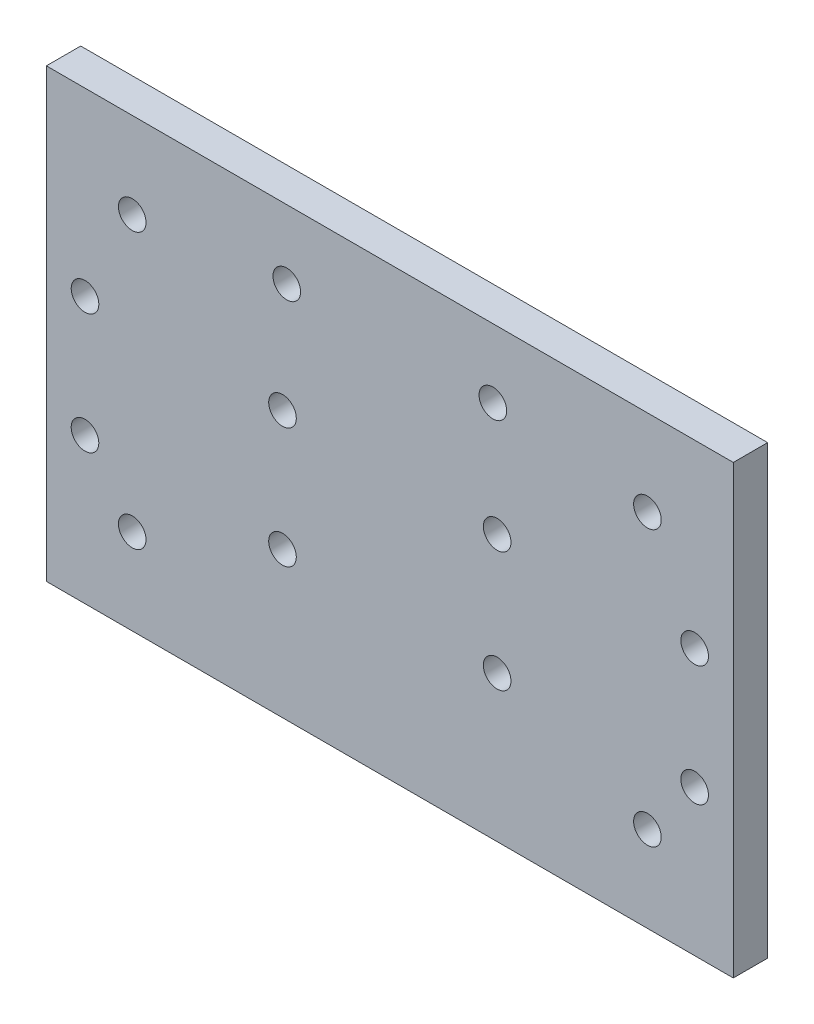
ISO-10303-21;
HEADER;
FILE_DESCRIPTION(('STEP AP214'),'2;1');
FILE_NAME('part.step','',(''),(''),'','','');
FILE_SCHEMA(('AUTOMOTIVE_DESIGN { 1 0 10303 214 1 1 1 1 }'));
ENDSEC;
DATA;
#1=APPLICATION_CONTEXT('core data for automotive mechanical design processes');
#2=APPLICATION_PROTOCOL_DEFINITION('international standard','automotive_design',2000,#1);
#3=PRODUCT_CONTEXT('',#1,'mechanical');
#4=PRODUCT('Part','Part','',(#3));
#5=PRODUCT_RELATED_PRODUCT_CATEGORY('part','',(#4));
#6=PRODUCT_DEFINITION_FORMATION('','',#4);
#7=PRODUCT_DEFINITION_CONTEXT('part definition',#1,'design');
#8=PRODUCT_DEFINITION('design','',#6,#7);
#9=PRODUCT_DEFINITION_SHAPE('','',#8);
#10=(LENGTH_UNIT() NAMED_UNIT(*) SI_UNIT(.MILLI.,.METRE.));
#11=(NAMED_UNIT(*) PLANE_ANGLE_UNIT() SI_UNIT($,.RADIAN.));
#12=(NAMED_UNIT(*) SI_UNIT($,.STERADIAN.) SOLID_ANGLE_UNIT());
#13=UNCERTAINTY_MEASURE_WITH_UNIT(LENGTH_MEASURE(1.E-05),#10,'distance_accuracy_value','');
#14=(GEOMETRIC_REPRESENTATION_CONTEXT(3) GLOBAL_UNCERTAINTY_ASSIGNED_CONTEXT((#13)) GLOBAL_UNIT_ASSIGNED_CONTEXT((#10,
#11,#12)) REPRESENTATION_CONTEXT('',''));
#15=CARTESIAN_POINT('',(0.,0.,0.));
#16=DIRECTION('',(0.,0.,1.));
#17=DIRECTION('',(1.,0.,0.));
#18=AXIS2_PLACEMENT_3D('',#15,#16,#17);
#19=CARTESIAN_POINT('',(0.,0.,0.));
#20=DIRECTION('',(0.,0.,1.));
#21=DIRECTION('',(1.,0.,0.));
#22=AXIS2_PLACEMENT_3D('',#19,#20,#21);
#23=PLANE('',#22);
#24=CARTESIAN_POINT('',(-47.625,-25.4,0.));
#25=DIRECTION('',(0.,0.,-1.));
#26=DIRECTION('',(-1.,0.,0.));
#27=AXIS2_PLACEMENT_3D('',#24,#25,#26);
#28=CIRCLE('',#27,2.55269999999999);
#29=CARTESIAN_POINT('',(-50.1777,-25.4,0.));
#30=VERTEX_POINT('',#29);
#31=EDGE_CURVE('E190',#30,#30,#28,.T.);
#32=ORIENTED_EDGE('',*,*,#31,.F.);
#33=EDGE_LOOP('',(#32));
#34=FACE_BOUND('',#33,.T.);
#35=CARTESIAN_POINT('',(-47.625,25.4,0.));
#36=DIRECTION('',(0.,0.,-1.));
#37=DIRECTION('',(-1.,0.,0.));
#38=AXIS2_PLACEMENT_3D('',#35,#36,#37);
#39=CIRCLE('',#38,2.55269999999998);
#40=CARTESIAN_POINT('',(-50.1777,25.4,0.));
#41=VERTEX_POINT('',#40);
#42=EDGE_CURVE('E178',#41,#41,#39,.T.);
#43=ORIENTED_EDGE('',*,*,#42,.F.);
#44=EDGE_LOOP('',(#43));
#45=FACE_BOUND('',#44,.T.);
#46=CARTESIAN_POINT('',(-19.844,7.93749999999997,0.));
#47=DIRECTION('',(0.,0.,-1.));
#48=DIRECTION('',(-1.,0.,0.));
#49=AXIS2_PLACEMENT_3D('',#46,#47,#48);
#50=CIRCLE('',#49,2.55269999999999);
#51=CARTESIAN_POINT('',(-22.3967,7.93749999999997,0.));
#52=VERTEX_POINT('',#51);
#53=EDGE_CURVE('E148',#52,#52,#50,.T.);
#54=ORIENTED_EDGE('',*,*,#53,.F.);
#55=EDGE_LOOP('',(#54));
#56=FACE_BOUND('',#55,.T.);
#57=CARTESIAN_POINT('',(-56.3565,-14.2875,0.));
#58=DIRECTION('',(0.,0.,-1.));
#59=DIRECTION('',(-1.,0.,0.));
#60=AXIS2_PLACEMENT_3D('',#57,#58,#59);
#61=CIRCLE('',#60,2.55269999999998);
#62=CARTESIAN_POINT('',(-58.9092,-14.2875,0.));
#63=VERTEX_POINT('',#62);
#64=EDGE_CURVE('E142',#63,#63,#61,.T.);
#65=ORIENTED_EDGE('',*,*,#64,.F.);
#66=EDGE_LOOP('',(#65));
#67=FACE_BOUND('',#66,.T.);
#68=CARTESIAN_POINT('',(-19.844,-14.2875,0.));
#69=DIRECTION('',(0.,0.,-1.));
#70=DIRECTION('',(-1.,0.,0.));
#71=AXIS2_PLACEMENT_3D('',#68,#69,#70);
#72=CIRCLE('',#71,2.55269999999999);
#73=CARTESIAN_POINT('',(-22.3967,-14.2875,0.));
#74=VERTEX_POINT('',#73);
#75=EDGE_CURVE('E136',#74,#74,#72,.T.);
#76=ORIENTED_EDGE('',*,*,#75,.F.);
#77=EDGE_LOOP('',(#76));
#78=FACE_BOUND('',#77,.T.);
#79=CARTESIAN_POINT('',(-56.3565,7.9375,0.));
#80=DIRECTION('',(0.,0.,-1.));
#81=DIRECTION('',(-1.,0.,0.));
#82=AXIS2_PLACEMENT_3D('',#79,#80,#81);
#83=CIRCLE('',#82,2.55269999999998);
#84=CARTESIAN_POINT('',(-58.9092,7.9375,0.));
#85=VERTEX_POINT('',#84);
#86=EDGE_CURVE('E130',#85,#85,#83,.T.);
#87=ORIENTED_EDGE('',*,*,#86,.F.);
#88=EDGE_LOOP('',(#87));
#89=FACE_BOUND('',#88,.T.);
#90=CARTESIAN_POINT('',(19.05,28.575,0.));
#91=DIRECTION('',(0.,0.,-1.));
#92=DIRECTION('',(-1.,0.,0.));
#93=AXIS2_PLACEMENT_3D('',#90,#91,#92);
#94=CIRCLE('',#93,2.55269999999999);
#95=CARTESIAN_POINT('',(16.4973,28.575,0.));
#96=VERTEX_POINT('',#95);
#97=EDGE_CURVE('E124',#96,#96,#94,.T.);
#98=ORIENTED_EDGE('',*,*,#97,.F.);
#99=EDGE_LOOP('',(#98));
#100=FACE_BOUND('',#99,.T.);
#101=CARTESIAN_POINT('',(-19.05,28.575,0.));
#102=DIRECTION('',(0.,0.,-1.));
#103=DIRECTION('',(-1.,0.,0.));
#104=AXIS2_PLACEMENT_3D('',#101,#102,#103);
#105=CIRCLE('',#104,2.55269999999999);
#106=CARTESIAN_POINT('',(-21.6027,28.575,0.));
#107=VERTEX_POINT('',#106);
#108=EDGE_CURVE('E118',#107,#107,#105,.T.);
#109=ORIENTED_EDGE('',*,*,#108,.F.);
#110=EDGE_LOOP('',(#109));
#111=FACE_BOUND('',#110,.T.);
#112=DIRECTION('',(0.,1.,0.));
#113=VECTOR('',#112,1.);
#114=CARTESIAN_POINT('',(63.5,41.275,0.));
#115=LINE('',#114,#113);
#116=CARTESIAN_POINT('',(63.5,-41.275,0.));
#117=VERTEX_POINT('',#116);
#118=CARTESIAN_POINT('',(63.5,41.275,0.));
#119=VERTEX_POINT('',#118);
#120=EDGE_CURVE('E102',#117,#119,#115,.T.);
#121=ORIENTED_EDGE('',*,*,#120,.F.);
#122=DIRECTION('',(1.,0.,0.));
#123=VECTOR('',#122,1.);
#124=CARTESIAN_POINT('',(-63.5,-41.275,0.));
#125=LINE('',#124,#123);
#126=CARTESIAN_POINT('',(-63.5,-41.275,0.));
#127=VERTEX_POINT('',#126);
#128=EDGE_CURVE('E78',#127,#117,#125,.T.);
#129=ORIENTED_EDGE('',*,*,#128,.F.);
#130=DIRECTION('',(0.,-1.,0.));
#131=VECTOR('',#130,1.);
#132=CARTESIAN_POINT('',(-63.5,41.275,0.));
#133=LINE('',#132,#131);
#134=CARTESIAN_POINT('',(-63.5,41.275,0.));
#135=VERTEX_POINT('',#134);
#136=EDGE_CURVE('E72',#135,#127,#133,.T.);
#137=ORIENTED_EDGE('',*,*,#136,.F.);
#138=DIRECTION('',(-1.,0.,0.));
#139=VECTOR('',#138,1.);
#140=CARTESIAN_POINT('',(-63.5,41.275,0.));
#141=LINE('',#140,#139);
#142=EDGE_CURVE('E94',#119,#135,#141,.T.);
#143=ORIENTED_EDGE('',*,*,#142,.F.);
#144=EDGE_LOOP('',(#121,#129,#137,#143));
#145=FACE_BOUND('',#144,.T.);
#146=CARTESIAN_POINT('',(19.844,7.93749999999997,0.));
#147=DIRECTION('',(0.,0.,-1.));
#148=DIRECTION('',(-1.,0.,0.));
#149=AXIS2_PLACEMENT_3D('',#146,#147,#148);
#150=CIRCLE('',#149,2.55269999999999);
#151=CARTESIAN_POINT('',(17.2913,7.93749999999997,0.));
#152=VERTEX_POINT('',#151);
#153=EDGE_CURVE('E154',#152,#152,#150,.T.);
#154=ORIENTED_EDGE('',*,*,#153,.F.);
#155=EDGE_LOOP('',(#154));
#156=FACE_BOUND('',#155,.T.);
#157=CARTESIAN_POINT('',(56.3565,-14.2875,0.));
#158=DIRECTION('',(0.,0.,-1.));
#159=DIRECTION('',(-1.,0.,0.));
#160=AXIS2_PLACEMENT_3D('',#157,#158,#159);
#161=CIRCLE('',#160,2.55269999999999);
#162=CARTESIAN_POINT('',(53.8038,-14.2875,0.));
#163=VERTEX_POINT('',#162);
#164=EDGE_CURVE('E160',#163,#163,#161,.T.);
#165=ORIENTED_EDGE('',*,*,#164,.F.);
#166=EDGE_LOOP('',(#165));
#167=FACE_BOUND('',#166,.T.);
#168=CARTESIAN_POINT('',(19.844,-14.2875,0.));
#169=DIRECTION('',(0.,0.,-1.));
#170=DIRECTION('',(-1.,0.,0.));
#171=AXIS2_PLACEMENT_3D('',#168,#169,#170);
#172=CIRCLE('',#171,2.55269999999999);
#173=CARTESIAN_POINT('',(17.2913,-14.2875,0.));
#174=VERTEX_POINT('',#173);
#175=EDGE_CURVE('E166',#174,#174,#172,.T.);
#176=ORIENTED_EDGE('',*,*,#175,.F.);
#177=EDGE_LOOP('',(#176));
#178=FACE_BOUND('',#177,.T.);
#179=CARTESIAN_POINT('',(56.3565,7.93749999999999,0.));
#180=DIRECTION('',(0.,0.,-1.));
#181=DIRECTION('',(-1.,0.,0.));
#182=AXIS2_PLACEMENT_3D('',#179,#180,#181);
#183=CIRCLE('',#182,2.55269999999998);
#184=CARTESIAN_POINT('',(53.8038,7.93749999999999,0.));
#185=VERTEX_POINT('',#184);
#186=EDGE_CURVE('E172',#185,#185,#183,.T.);
#187=ORIENTED_EDGE('',*,*,#186,.F.);
#188=EDGE_LOOP('',(#187));
#189=FACE_BOUND('',#188,.T.);
#190=CARTESIAN_POINT('',(47.625,-25.4,0.));
#191=DIRECTION('',(0.,0.,-1.));
#192=DIRECTION('',(-1.,0.,0.));
#193=AXIS2_PLACEMENT_3D('',#190,#191,#192);
#194=CIRCLE('',#193,2.55269999999999);
#195=CARTESIAN_POINT('',(45.0723,-25.4,0.));
#196=VERTEX_POINT('',#195);
#197=EDGE_CURVE('E184',#196,#196,#194,.T.);
#198=ORIENTED_EDGE('',*,*,#197,.F.);
#199=EDGE_LOOP('',(#198));
#200=FACE_BOUND('',#199,.T.);
#201=CARTESIAN_POINT('',(47.625,25.4,0.));
#202=DIRECTION('',(0.,0.,-1.));
#203=DIRECTION('',(-1.,0.,0.));
#204=AXIS2_PLACEMENT_3D('',#201,#202,#203);
#205=CIRCLE('',#204,2.55269999999998);
#206=CARTESIAN_POINT('',(45.0723,25.4,0.));
#207=VERTEX_POINT('',#206);
#208=EDGE_CURVE('E196',#207,#207,#205,.T.);
#209=ORIENTED_EDGE('',*,*,#208,.F.);
#210=EDGE_LOOP('',(#209));
#211=FACE_BOUND('',#210,.T.);
#212=ADVANCED_FACE('F38',(#34,#45,#56,#67,#78,#89,#100,#111,#145,#156,#167,#178,#189,#200,#211),
#23,.F.);
#213=CARTESIAN_POINT('',(63.5,41.275,6.34999999999999));
#214=DIRECTION('',(-1.,0.,0.));
#215=DIRECTION('',(0.,-1.,0.));
#216=AXIS2_PLACEMENT_3D('',#213,#214,#215);
#217=PLANE('',#216);
#218=ORIENTED_EDGE('',*,*,#120,.T.);
#219=DIRECTION('',(0.,0.,-1.));
#220=VECTOR('',#219,1.);
#221=CARTESIAN_POINT('',(63.5,41.275,6.34999999999999));
#222=LINE('',#221,#220);
#223=CARTESIAN_POINT('',(63.5,41.275,6.34999999999999));
#224=VERTEX_POINT('',#223);
#225=EDGE_CURVE('E11',#224,#119,#222,.T.);
#226=ORIENTED_EDGE('',*,*,#225,.F.);
#227=DIRECTION('',(0.,1.,0.));
#228=VECTOR('',#227,1.);
#229=CARTESIAN_POINT('',(63.5,41.275,6.34999999999999));
#230=LINE('',#229,#228);
#231=CARTESIAN_POINT('',(63.5,-41.275,6.34999999999999));
#232=VERTEX_POINT('',#231);
#233=EDGE_CURVE('E90',#232,#224,#230,.T.);
#234=ORIENTED_EDGE('',*,*,#233,.F.);
#235=DIRECTION('',(0.,0.,-1.));
#236=VECTOR('',#235,1.);
#237=CARTESIAN_POINT('',(63.5,-41.275,6.34999999999999));
#238=LINE('',#237,#236);
#239=EDGE_CURVE('E98',#232,#117,#238,.T.);
#240=ORIENTED_EDGE('',*,*,#239,.T.);
#241=EDGE_LOOP('',(#218,#226,#234,#240));
#242=FACE_BOUND('',#241,.T.);
#243=ADVANCED_FACE('F40',(#242),#217,.F.);
#244=CARTESIAN_POINT('',(-63.5,41.275,6.34999999999999));
#245=DIRECTION('',(0.,-1.,0.));
#246=DIRECTION('',(0.,0.,-1.));
#247=AXIS2_PLACEMENT_3D('',#244,#245,#246);
#248=PLANE('',#247);
#249=ORIENTED_EDGE('',*,*,#142,.T.);
#250=DIRECTION('',(0.,0.,-1.));
#251=VECTOR('',#250,1.);
#252=CARTESIAN_POINT('',(-63.5,41.275,6.34999999999999));
#253=LINE('',#252,#251);
#254=CARTESIAN_POINT('',(-63.5,41.275,6.34999999999999));
#255=VERTEX_POINT('',#254);
#256=EDGE_CURVE('E47',#255,#135,#253,.T.);
#257=ORIENTED_EDGE('',*,*,#256,.F.);
#258=DIRECTION('',(-1.,0.,0.));
#259=VECTOR('',#258,1.);
#260=CARTESIAN_POINT('',(-63.5,41.275,6.34999999999999));
#261=LINE('',#260,#259);
#262=EDGE_CURVE('E85',#224,#255,#261,.T.);
#263=ORIENTED_EDGE('',*,*,#262,.F.);
#264=ORIENTED_EDGE('',*,*,#225,.T.);
#265=EDGE_LOOP('',(#249,#257,#263,#264));
#266=FACE_BOUND('',#265,.T.);
#267=ADVANCED_FACE('F93',(#266),#248,.F.);
#268=CARTESIAN_POINT('',(-63.5,41.275,6.34999999999999));
#269=DIRECTION('',(1.,0.,0.));
#270=DIRECTION('',(0.,0.,-1.));
#271=AXIS2_PLACEMENT_3D('',#268,#269,#270);
#272=PLANE('',#271);
#273=ORIENTED_EDGE('',*,*,#136,.T.);
#274=DIRECTION('',(0.,0.,-1.));
#275=VECTOR('',#274,1.);
#276=CARTESIAN_POINT('',(-63.5,-41.275,6.34999999999999));
#277=LINE('',#276,#275);
#278=CARTESIAN_POINT('',(-63.5,-41.275,6.34999999999999));
#279=VERTEX_POINT('',#278);
#280=EDGE_CURVE('E95',#279,#127,#277,.T.);
#281=ORIENTED_EDGE('',*,*,#280,.F.);
#282=DIRECTION('',(0.,-1.,0.));
#283=VECTOR('',#282,1.);
#284=CARTESIAN_POINT('',(-63.5,41.275,6.34999999999999));
#285=LINE('',#284,#283);
#286=EDGE_CURVE('E88',#255,#279,#285,.T.);
#287=ORIENTED_EDGE('',*,*,#286,.F.);
#288=ORIENTED_EDGE('',*,*,#256,.T.);
#289=EDGE_LOOP('',(#273,#281,#287,#288));
#290=FACE_BOUND('',#289,.T.);
#291=ADVANCED_FACE('F96',(#290),#272,.F.);
#292=CARTESIAN_POINT('',(-63.5,-41.275,6.34999999999999));
#293=DIRECTION('',(0.,1.,0.));
#294=DIRECTION('',(0.,0.,1.));
#295=AXIS2_PLACEMENT_3D('',#292,#293,#294);
#296=PLANE('',#295);
#297=ORIENTED_EDGE('',*,*,#128,.T.);
#298=ORIENTED_EDGE('',*,*,#239,.F.);
#299=DIRECTION('',(1.,0.,0.));
#300=VECTOR('',#299,1.);
#301=CARTESIAN_POINT('',(-63.5,-41.275,6.34999999999999));
#302=LINE('',#301,#300);
#303=EDGE_CURVE('E55',#279,#232,#302,.T.);
#304=ORIENTED_EDGE('',*,*,#303,.F.);
#305=ORIENTED_EDGE('',*,*,#280,.T.);
#306=EDGE_LOOP('',(#297,#298,#304,#305));
#307=FACE_BOUND('',#306,.T.);
#308=ADVANCED_FACE('F110',(#307),#296,.F.);
#309=CARTESIAN_POINT('',(0.,0.,6.34999999999999));
#310=DIRECTION('',(0.,0.,1.));
#311=DIRECTION('',(1.,0.,0.));
#312=AXIS2_PLACEMENT_3D('',#309,#310,#311);
#313=PLANE('',#312);
#314=CARTESIAN_POINT('',(47.625,25.4,6.34999999999999));
#315=DIRECTION('',(0.,0.,1.));
#316=DIRECTION('',(1.,0.,0.));
#317=AXIS2_PLACEMENT_3D('',#314,#315,#316);
#318=CIRCLE('',#317,2.55269999999999);
#319=CARTESIAN_POINT('',(50.1777,25.4,6.34999999999999));
#320=VERTEX_POINT('',#319);
#321=EDGE_CURVE('E193',#320,#320,#318,.T.);
#322=ORIENTED_EDGE('',*,*,#321,.F.);
#323=EDGE_LOOP('',(#322));
#324=FACE_BOUND('',#323,.T.);
#325=CARTESIAN_POINT('',(-47.625,-25.4,6.34999999999999));
#326=DIRECTION('',(0.,0.,1.));
#327=DIRECTION('',(1.,0.,0.));
#328=AXIS2_PLACEMENT_3D('',#325,#326,#327);
#329=CIRCLE('',#328,2.55269999999999);
#330=CARTESIAN_POINT('',(-45.0723,-25.4,6.34999999999999));
#331=VERTEX_POINT('',#330);
#332=EDGE_CURVE('E187',#331,#331,#329,.T.);
#333=ORIENTED_EDGE('',*,*,#332,.F.);
#334=EDGE_LOOP('',(#333));
#335=FACE_BOUND('',#334,.T.);
#336=CARTESIAN_POINT('',(47.625,-25.4,6.34999999999999));
#337=DIRECTION('',(0.,0.,1.));
#338=DIRECTION('',(1.,0.,0.));
#339=AXIS2_PLACEMENT_3D('',#336,#337,#338);
#340=CIRCLE('',#339,2.55269999999999);
#341=CARTESIAN_POINT('',(50.1777,-25.4,6.34999999999999));
#342=VERTEX_POINT('',#341);
#343=EDGE_CURVE('E181',#342,#342,#340,.T.);
#344=ORIENTED_EDGE('',*,*,#343,.F.);
#345=EDGE_LOOP('',(#344));
#346=FACE_BOUND('',#345,.T.);
#347=CARTESIAN_POINT('',(-47.625,25.4,6.34999999999999));
#348=DIRECTION('',(0.,0.,1.));
#349=DIRECTION('',(1.,0.,0.));
#350=AXIS2_PLACEMENT_3D('',#347,#348,#349);
#351=CIRCLE('',#350,2.55269999999999);
#352=CARTESIAN_POINT('',(-45.0723,25.4,6.34999999999999));
#353=VERTEX_POINT('',#352);
#354=EDGE_CURVE('E175',#353,#353,#351,.T.);
#355=ORIENTED_EDGE('',*,*,#354,.F.);
#356=EDGE_LOOP('',(#355));
#357=FACE_BOUND('',#356,.T.);
#358=CARTESIAN_POINT('',(56.3565,7.93749999999999,6.34999999999999));
#359=DIRECTION('',(0.,0.,1.));
#360=DIRECTION('',(1.,0.,0.));
#361=AXIS2_PLACEMENT_3D('',#358,#359,#360);
#362=CIRCLE('',#361,2.55269999999999);
#363=CARTESIAN_POINT('',(58.9092,7.93749999999999,6.34999999999999));
#364=VERTEX_POINT('',#363);
#365=EDGE_CURVE('E169',#364,#364,#362,.T.);
#366=ORIENTED_EDGE('',*,*,#365,.F.);
#367=EDGE_LOOP('',(#366));
#368=FACE_BOUND('',#367,.T.);
#369=CARTESIAN_POINT('',(19.844,-14.2875,6.34999999999999));
#370=DIRECTION('',(0.,0.,1.));
#371=DIRECTION('',(1.,0.,0.));
#372=AXIS2_PLACEMENT_3D('',#369,#370,#371);
#373=CIRCLE('',#372,2.55269999999999);
#374=CARTESIAN_POINT('',(22.3967,-14.2875,6.34999999999999));
#375=VERTEX_POINT('',#374);
#376=EDGE_CURVE('E163',#375,#375,#373,.T.);
#377=ORIENTED_EDGE('',*,*,#376,.F.);
#378=EDGE_LOOP('',(#377));
#379=FACE_BOUND('',#378,.T.);
#380=CARTESIAN_POINT('',(56.3565,-14.2875,6.34999999999999));
#381=DIRECTION('',(0.,0.,1.));
#382=DIRECTION('',(1.,0.,0.));
#383=AXIS2_PLACEMENT_3D('',#380,#381,#382);
#384=CIRCLE('',#383,2.55269999999999);
#385=CARTESIAN_POINT('',(58.9092,-14.2875,6.34999999999999));
#386=VERTEX_POINT('',#385);
#387=EDGE_CURVE('E157',#386,#386,#384,.T.);
#388=ORIENTED_EDGE('',*,*,#387,.F.);
#389=EDGE_LOOP('',(#388));
#390=FACE_BOUND('',#389,.T.);
#391=CARTESIAN_POINT('',(19.844,7.93749999999997,6.34999999999999));
#392=DIRECTION('',(0.,0.,1.));
#393=DIRECTION('',(1.,0.,0.));
#394=AXIS2_PLACEMENT_3D('',#391,#392,#393);
#395=CIRCLE('',#394,2.55269999999999);
#396=CARTESIAN_POINT('',(22.3967,7.93749999999997,6.34999999999999));
#397=VERTEX_POINT('',#396);
#398=EDGE_CURVE('E151',#397,#397,#395,.T.);
#399=ORIENTED_EDGE('',*,*,#398,.F.);
#400=EDGE_LOOP('',(#399));
#401=FACE_BOUND('',#400,.T.);
#402=CARTESIAN_POINT('',(-19.844,7.93749999999997,6.34999999999999));
#403=DIRECTION('',(0.,0.,1.));
#404=DIRECTION('',(1.,0.,0.));
#405=AXIS2_PLACEMENT_3D('',#402,#403,#404);
#406=CIRCLE('',#405,2.55269999999999);
#407=CARTESIAN_POINT('',(-17.2913,7.93749999999997,6.34999999999999));
#408=VERTEX_POINT('',#407);
#409=EDGE_CURVE('E145',#408,#408,#406,.T.);
#410=ORIENTED_EDGE('',*,*,#409,.F.);
#411=EDGE_LOOP('',(#410));
#412=FACE_BOUND('',#411,.T.);
#413=CARTESIAN_POINT('',(-56.3565,-14.2875,6.34999999999999));
#414=DIRECTION('',(0.,0.,1.));
#415=DIRECTION('',(1.,0.,0.));
#416=AXIS2_PLACEMENT_3D('',#413,#414,#415);
#417=CIRCLE('',#416,2.55269999999999);
#418=CARTESIAN_POINT('',(-53.8038,-14.2875,6.34999999999999));
#419=VERTEX_POINT('',#418);
#420=EDGE_CURVE('E139',#419,#419,#417,.T.);
#421=ORIENTED_EDGE('',*,*,#420,.F.);
#422=EDGE_LOOP('',(#421));
#423=FACE_BOUND('',#422,.T.);
#424=CARTESIAN_POINT('',(-19.844,-14.2875,6.34999999999999));
#425=DIRECTION('',(0.,0.,1.));
#426=DIRECTION('',(1.,0.,0.));
#427=AXIS2_PLACEMENT_3D('',#424,#425,#426);
#428=CIRCLE('',#427,2.55269999999999);
#429=CARTESIAN_POINT('',(-17.2913,-14.2875,6.34999999999999));
#430=VERTEX_POINT('',#429);
#431=EDGE_CURVE('E133',#430,#430,#428,.T.);
#432=ORIENTED_EDGE('',*,*,#431,.F.);
#433=EDGE_LOOP('',(#432));
#434=FACE_BOUND('',#433,.T.);
#435=CARTESIAN_POINT('',(-56.3565,7.9375,6.34999999999999));
#436=DIRECTION('',(0.,0.,1.));
#437=DIRECTION('',(1.,0.,0.));
#438=AXIS2_PLACEMENT_3D('',#435,#436,#437);
#439=CIRCLE('',#438,2.55269999999999);
#440=CARTESIAN_POINT('',(-53.8038,7.9375,6.34999999999999));
#441=VERTEX_POINT('',#440);
#442=EDGE_CURVE('E127',#441,#441,#439,.T.);
#443=ORIENTED_EDGE('',*,*,#442,.F.);
#444=EDGE_LOOP('',(#443));
#445=FACE_BOUND('',#444,.T.);
#446=CARTESIAN_POINT('',(19.05,28.575,6.34999999999999));
#447=DIRECTION('',(0.,0.,1.));
#448=DIRECTION('',(1.,0.,0.));
#449=AXIS2_PLACEMENT_3D('',#446,#447,#448);
#450=CIRCLE('',#449,2.55269999999999);
#451=CARTESIAN_POINT('',(21.6027,28.575,6.34999999999999));
#452=VERTEX_POINT('',#451);
#453=EDGE_CURVE('E121',#452,#452,#450,.T.);
#454=ORIENTED_EDGE('',*,*,#453,.F.);
#455=EDGE_LOOP('',(#454));
#456=FACE_BOUND('',#455,.T.);
#457=CARTESIAN_POINT('',(-19.05,28.575,6.34999999999999));
#458=DIRECTION('',(0.,0.,1.));
#459=DIRECTION('',(1.,0.,0.));
#460=AXIS2_PLACEMENT_3D('',#457,#458,#459);
#461=CIRCLE('',#460,2.55269999999999);
#462=CARTESIAN_POINT('',(-16.4973,28.575,6.34999999999999));
#463=VERTEX_POINT('',#462);
#464=EDGE_CURVE('E105',#463,#463,#461,.T.);
#465=ORIENTED_EDGE('',*,*,#464,.F.);
#466=EDGE_LOOP('',(#465));
#467=FACE_BOUND('',#466,.T.);
#468=ORIENTED_EDGE('',*,*,#233,.T.);
#469=ORIENTED_EDGE('',*,*,#262,.T.);
#470=ORIENTED_EDGE('',*,*,#286,.T.);
#471=ORIENTED_EDGE('',*,*,#303,.T.);
#472=EDGE_LOOP('',(#468,#469,#470,#471));
#473=FACE_BOUND('',#472,.T.);
#474=ADVANCED_FACE('F86',(#324,#335,#346,#357,#368,#379,#390,#401,#412,#423,#434,#445,#456,#467,
#473),#313,.T.);
#475=CARTESIAN_POINT('',(-19.05,28.575,0.));
#476=DIRECTION('',(0.,0.,-1.));
#477=DIRECTION('',(-1.,0.,0.));
#478=AXIS2_PLACEMENT_3D('',#475,#476,#477);
#479=CYLINDRICAL_SURFACE('',#478,2.55269999999999);
#480=ORIENTED_EDGE('',*,*,#108,.T.);
#481=EDGE_LOOP('',(#480));
#482=FACE_BOUND('',#481,.T.);
#483=ORIENTED_EDGE('',*,*,#464,.T.);
#484=EDGE_LOOP('',(#483));
#485=FACE_BOUND('',#484,.T.);
#486=ADVANCED_FACE('F236',(#482,#485),#479,.F.);
#487=CARTESIAN_POINT('',(19.05,28.575,0.));
#488=DIRECTION('',(0.,0.,-1.));
#489=DIRECTION('',(-1.,0.,0.));
#490=AXIS2_PLACEMENT_3D('',#487,#488,#489);
#491=CYLINDRICAL_SURFACE('',#490,2.55269999999999);
#492=ORIENTED_EDGE('',*,*,#97,.T.);
#493=EDGE_LOOP('',(#492));
#494=FACE_BOUND('',#493,.T.);
#495=ORIENTED_EDGE('',*,*,#453,.T.);
#496=EDGE_LOOP('',(#495));
#497=FACE_BOUND('',#496,.T.);
#498=ADVANCED_FACE('F243',(#494,#497),#491,.F.);
#499=CARTESIAN_POINT('',(-56.3565,7.9375,0.));
#500=DIRECTION('',(0.,0.,-1.));
#501=DIRECTION('',(-1.,0.,0.));
#502=AXIS2_PLACEMENT_3D('',#499,#500,#501);
#503=CYLINDRICAL_SURFACE('',#502,2.55269999999999);
#504=ORIENTED_EDGE('',*,*,#86,.T.);
#505=EDGE_LOOP('',(#504));
#506=FACE_BOUND('',#505,.T.);
#507=ORIENTED_EDGE('',*,*,#442,.T.);
#508=EDGE_LOOP('',(#507));
#509=FACE_BOUND('',#508,.T.);
#510=ADVANCED_FACE('F250',(#506,#509),#503,.F.);
#511=CARTESIAN_POINT('',(-19.844,-14.2875,0.));
#512=DIRECTION('',(0.,0.,-1.));
#513=DIRECTION('',(-1.,0.,0.));
#514=AXIS2_PLACEMENT_3D('',#511,#512,#513);
#515=CYLINDRICAL_SURFACE('',#514,2.55269999999999);
#516=ORIENTED_EDGE('',*,*,#75,.T.);
#517=EDGE_LOOP('',(#516));
#518=FACE_BOUND('',#517,.T.);
#519=ORIENTED_EDGE('',*,*,#431,.T.);
#520=EDGE_LOOP('',(#519));
#521=FACE_BOUND('',#520,.T.);
#522=ADVANCED_FACE('F258',(#518,#521),#515,.F.);
#523=CARTESIAN_POINT('',(-56.3565,-14.2875,0.));
#524=DIRECTION('',(0.,0.,-1.));
#525=DIRECTION('',(-1.,0.,0.));
#526=AXIS2_PLACEMENT_3D('',#523,#524,#525);
#527=CYLINDRICAL_SURFACE('',#526,2.55269999999999);
#528=ORIENTED_EDGE('',*,*,#64,.T.);
#529=EDGE_LOOP('',(#528));
#530=FACE_BOUND('',#529,.T.);
#531=ORIENTED_EDGE('',*,*,#420,.T.);
#532=EDGE_LOOP('',(#531));
#533=FACE_BOUND('',#532,.T.);
#534=ADVANCED_FACE('F266',(#530,#533),#527,.F.);
#535=CARTESIAN_POINT('',(-19.844,7.93749999999997,0.));
#536=DIRECTION('',(0.,0.,-1.));
#537=DIRECTION('',(-1.,0.,0.));
#538=AXIS2_PLACEMENT_3D('',#535,#536,#537);
#539=CYLINDRICAL_SURFACE('',#538,2.55269999999999);
#540=ORIENTED_EDGE('',*,*,#53,.T.);
#541=EDGE_LOOP('',(#540));
#542=FACE_BOUND('',#541,.T.);
#543=ORIENTED_EDGE('',*,*,#409,.T.);
#544=EDGE_LOOP('',(#543));
#545=FACE_BOUND('',#544,.T.);
#546=ADVANCED_FACE('F274',(#542,#545),#539,.F.);
#547=CARTESIAN_POINT('',(19.844,7.93749999999997,0.));
#548=DIRECTION('',(0.,0.,-1.));
#549=DIRECTION('',(-1.,0.,0.));
#550=AXIS2_PLACEMENT_3D('',#547,#548,#549);
#551=CYLINDRICAL_SURFACE('',#550,2.55269999999999);
#552=ORIENTED_EDGE('',*,*,#153,.T.);
#553=EDGE_LOOP('',(#552));
#554=FACE_BOUND('',#553,.T.);
#555=ORIENTED_EDGE('',*,*,#398,.T.);
#556=EDGE_LOOP('',(#555));
#557=FACE_BOUND('',#556,.T.);
#558=ADVANCED_FACE('F282',(#554,#557),#551,.F.);
#559=CARTESIAN_POINT('',(56.3565,-14.2875,0.));
#560=DIRECTION('',(0.,0.,-1.));
#561=DIRECTION('',(-1.,0.,0.));
#562=AXIS2_PLACEMENT_3D('',#559,#560,#561);
#563=CYLINDRICAL_SURFACE('',#562,2.55269999999999);
#564=ORIENTED_EDGE('',*,*,#164,.T.);
#565=EDGE_LOOP('',(#564));
#566=FACE_BOUND('',#565,.T.);
#567=ORIENTED_EDGE('',*,*,#387,.T.);
#568=EDGE_LOOP('',(#567));
#569=FACE_BOUND('',#568,.T.);
#570=ADVANCED_FACE('F290',(#566,#569),#563,.F.);
#571=CARTESIAN_POINT('',(19.844,-14.2875,0.));
#572=DIRECTION('',(0.,0.,-1.));
#573=DIRECTION('',(-1.,0.,0.));
#574=AXIS2_PLACEMENT_3D('',#571,#572,#573);
#575=CYLINDRICAL_SURFACE('',#574,2.55269999999999);
#576=ORIENTED_EDGE('',*,*,#175,.T.);
#577=EDGE_LOOP('',(#576));
#578=FACE_BOUND('',#577,.T.);
#579=ORIENTED_EDGE('',*,*,#376,.T.);
#580=EDGE_LOOP('',(#579));
#581=FACE_BOUND('',#580,.T.);
#582=ADVANCED_FACE('F298',(#578,#581),#575,.F.);
#583=CARTESIAN_POINT('',(56.3565,7.93749999999999,0.));
#584=DIRECTION('',(0.,0.,-1.));
#585=DIRECTION('',(-1.,0.,0.));
#586=AXIS2_PLACEMENT_3D('',#583,#584,#585);
#587=CYLINDRICAL_SURFACE('',#586,2.55269999999999);
#588=ORIENTED_EDGE('',*,*,#186,.T.);
#589=EDGE_LOOP('',(#588));
#590=FACE_BOUND('',#589,.T.);
#591=ORIENTED_EDGE('',*,*,#365,.T.);
#592=EDGE_LOOP('',(#591));
#593=FACE_BOUND('',#592,.T.);
#594=ADVANCED_FACE('F306',(#590,#593),#587,.F.);
#595=CARTESIAN_POINT('',(-47.625,25.4,0.));
#596=DIRECTION('',(0.,0.,-1.));
#597=DIRECTION('',(-1.,0.,0.));
#598=AXIS2_PLACEMENT_3D('',#595,#596,#597);
#599=CYLINDRICAL_SURFACE('',#598,2.55269999999999);
#600=ORIENTED_EDGE('',*,*,#42,.T.);
#601=EDGE_LOOP('',(#600));
#602=FACE_BOUND('',#601,.T.);
#603=ORIENTED_EDGE('',*,*,#354,.T.);
#604=EDGE_LOOP('',(#603));
#605=FACE_BOUND('',#604,.T.);
#606=ADVANCED_FACE('F314',(#602,#605),#599,.F.);
#607=CARTESIAN_POINT('',(47.625,-25.4,0.));
#608=DIRECTION('',(0.,0.,-1.));
#609=DIRECTION('',(-1.,0.,0.));
#610=AXIS2_PLACEMENT_3D('',#607,#608,#609);
#611=CYLINDRICAL_SURFACE('',#610,2.55269999999999);
#612=ORIENTED_EDGE('',*,*,#197,.T.);
#613=EDGE_LOOP('',(#612));
#614=FACE_BOUND('',#613,.T.);
#615=ORIENTED_EDGE('',*,*,#343,.T.);
#616=EDGE_LOOP('',(#615));
#617=FACE_BOUND('',#616,.T.);
#618=ADVANCED_FACE('F322',(#614,#617),#611,.F.);
#619=CARTESIAN_POINT('',(-47.625,-25.4,0.));
#620=DIRECTION('',(0.,0.,-1.));
#621=DIRECTION('',(-1.,0.,0.));
#622=AXIS2_PLACEMENT_3D('',#619,#620,#621);
#623=CYLINDRICAL_SURFACE('',#622,2.55269999999999);
#624=ORIENTED_EDGE('',*,*,#31,.T.);
#625=EDGE_LOOP('',(#624));
#626=FACE_BOUND('',#625,.T.);
#627=ORIENTED_EDGE('',*,*,#332,.T.);
#628=EDGE_LOOP('',(#627));
#629=FACE_BOUND('',#628,.T.);
#630=ADVANCED_FACE('F330',(#626,#629),#623,.F.);
#631=CARTESIAN_POINT('',(47.625,25.4,0.));
#632=DIRECTION('',(0.,0.,-1.));
#633=DIRECTION('',(-1.,0.,0.));
#634=AXIS2_PLACEMENT_3D('',#631,#632,#633);
#635=CYLINDRICAL_SURFACE('',#634,2.55269999999999);
#636=ORIENTED_EDGE('',*,*,#208,.T.);
#637=EDGE_LOOP('',(#636));
#638=FACE_BOUND('',#637,.T.);
#639=ORIENTED_EDGE('',*,*,#321,.T.);
#640=EDGE_LOOP('',(#639));
#641=FACE_BOUND('',#640,.T.);
#642=ADVANCED_FACE('F200',(#638,#641),#635,.F.);
#643=CLOSED_SHELL('',(#212,#243,#267,#291,#308,#474,#486,#498,#510,#522,#534,#546,#558,#570,
#582,#594,#606,#618,#630,#642));
#644=MANIFOLD_SOLID_BREP('B2',#643);
#645=ADVANCED_BREP_SHAPE_REPRESENTATION('',(#18,#644),#14);
#646=SHAPE_DEFINITION_REPRESENTATION(#9,#645);
ENDSEC;
END-ISO-10303-21;
